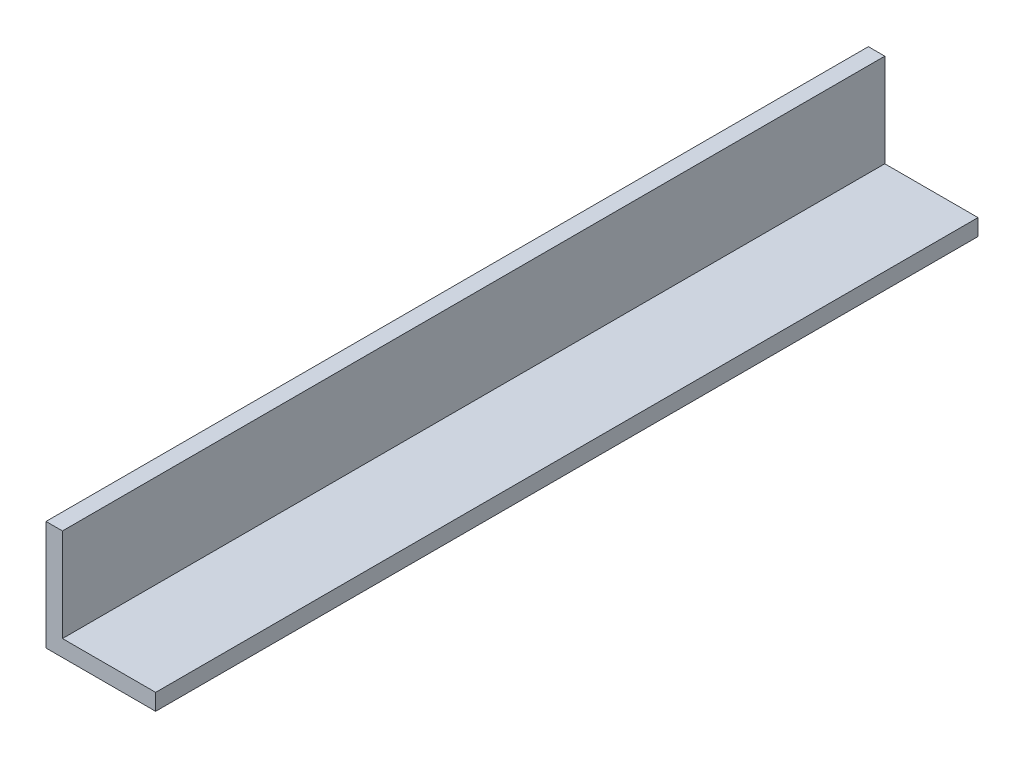
ISO-10303-21;
HEADER;
FILE_DESCRIPTION(('STEP AP214'),'2;1');
FILE_NAME('part.step','',(''),(''),'','','');
FILE_SCHEMA(('AUTOMOTIVE_DESIGN { 1 0 10303 214 1 1 1 1 }'));
ENDSEC;
DATA;
#1=APPLICATION_CONTEXT('core data for automotive mechanical design processes');
#2=APPLICATION_PROTOCOL_DEFINITION('international standard','automotive_design',2000,#1);
#3=PRODUCT_CONTEXT('',#1,'mechanical');
#4=PRODUCT('Part','Part','',(#3));
#5=PRODUCT_RELATED_PRODUCT_CATEGORY('part','',(#4));
#6=PRODUCT_DEFINITION_FORMATION('','',#4);
#7=PRODUCT_DEFINITION_CONTEXT('part definition',#1,'design');
#8=PRODUCT_DEFINITION('design','',#6,#7);
#9=PRODUCT_DEFINITION_SHAPE('','',#8);
#10=(LENGTH_UNIT() NAMED_UNIT(*) SI_UNIT(.MILLI.,.METRE.));
#11=(NAMED_UNIT(*) PLANE_ANGLE_UNIT() SI_UNIT($,.RADIAN.));
#12=(NAMED_UNIT(*) SI_UNIT($,.STERADIAN.) SOLID_ANGLE_UNIT());
#13=UNCERTAINTY_MEASURE_WITH_UNIT(LENGTH_MEASURE(1.E-05),#10,'distance_accuracy_value','');
#14=(GEOMETRIC_REPRESENTATION_CONTEXT(3) GLOBAL_UNCERTAINTY_ASSIGNED_CONTEXT((#13)) GLOBAL_UNIT_ASSIGNED_CONTEXT((#10,
#11,#12)) REPRESENTATION_CONTEXT('',''));
#15=CARTESIAN_POINT('',(0.,0.,0.));
#16=DIRECTION('',(0.,0.,1.));
#17=DIRECTION('',(1.,0.,0.));
#18=AXIS2_PLACEMENT_3D('',#15,#16,#17);
#19=CARTESIAN_POINT('',(20.,0.,150.));
#20=DIRECTION('',(-1.,0.,0.));
#21=DIRECTION('',(0.,0.,1.));
#22=AXIS2_PLACEMENT_3D('',#19,#20,#21);
#23=PLANE('',#22);
#24=DIRECTION('',(0.,1.,0.));
#25=VECTOR('',#24,1.);
#26=CARTESIAN_POINT('',(20.,0.,0.));
#27=LINE('',#26,#25);
#28=CARTESIAN_POINT('',(20.,0.,0.));
#29=VERTEX_POINT('',#28);
#30=CARTESIAN_POINT('',(20.,3.,0.));
#31=VERTEX_POINT('',#30);
#32=EDGE_CURVE('E128',#29,#31,#27,.T.);
#33=ORIENTED_EDGE('',*,*,#32,.T.);
#34=DIRECTION('',(0.,0.,-1.));
#35=VECTOR('',#34,1.);
#36=CARTESIAN_POINT('',(20.,3.,150.));
#37=LINE('',#36,#35);
#38=CARTESIAN_POINT('',(20.,3.,150.));
#39=VERTEX_POINT('',#38);
#40=EDGE_CURVE('E11',#39,#31,#37,.T.);
#41=ORIENTED_EDGE('',*,*,#40,.F.);
#42=DIRECTION('',(0.,1.,0.));
#43=VECTOR('',#42,1.);
#44=CARTESIAN_POINT('',(20.,0.,150.));
#45=LINE('',#44,#43);
#46=CARTESIAN_POINT('',(20.,0.,150.));
#47=VERTEX_POINT('',#46);
#48=EDGE_CURVE('E144',#47,#39,#45,.T.);
#49=ORIENTED_EDGE('',*,*,#48,.F.);
#50=DIRECTION('',(0.,0.,-1.));
#51=VECTOR('',#50,1.);
#52=CARTESIAN_POINT('',(20.,0.,150.));
#53=LINE('',#52,#51);
#54=EDGE_CURVE('E124',#47,#29,#53,.T.);
#55=ORIENTED_EDGE('',*,*,#54,.T.);
#56=EDGE_LOOP('',(#33,#41,#49,#55));
#57=FACE_BOUND('',#56,.T.);
#58=ADVANCED_FACE('F39',(#57),#23,.F.);
#59=CARTESIAN_POINT('',(20.,3.,150.));
#60=DIRECTION('',(0.,-1.,0.));
#61=DIRECTION('',(0.,0.,-1.));
#62=AXIS2_PLACEMENT_3D('',#59,#60,#61);
#63=PLANE('',#62);
#64=DIRECTION('',(-1.,0.,0.));
#65=VECTOR('',#64,1.);
#66=CARTESIAN_POINT('',(20.,3.,0.));
#67=LINE('',#66,#65);
#68=CARTESIAN_POINT('',(3.,3.,0.));
#69=VERTEX_POINT('',#68);
#70=EDGE_CURVE('E132',#31,#69,#67,.T.);
#71=ORIENTED_EDGE('',*,*,#70,.T.);
#72=DIRECTION('',(0.,0.,-1.));
#73=VECTOR('',#72,1.);
#74=CARTESIAN_POINT('',(3.,3.,150.));
#75=LINE('',#74,#73);
#76=CARTESIAN_POINT('',(3.,3.,150.));
#77=VERTEX_POINT('',#76);
#78=EDGE_CURVE('E48',#77,#69,#75,.T.);
#79=ORIENTED_EDGE('',*,*,#78,.F.);
#80=DIRECTION('',(-1.,0.,0.));
#81=VECTOR('',#80,1.);
#82=CARTESIAN_POINT('',(20.,3.,150.));
#83=LINE('',#82,#81);
#84=EDGE_CURVE('E93',#39,#77,#83,.T.);
#85=ORIENTED_EDGE('',*,*,#84,.F.);
#86=ORIENTED_EDGE('',*,*,#40,.T.);
#87=EDGE_LOOP('',(#71,#79,#85,#86));
#88=FACE_BOUND('',#87,.T.);
#89=ADVANCED_FACE('F172',(#88),#63,.F.);
#90=CARTESIAN_POINT('',(3.,20.,150.));
#91=DIRECTION('',(-1.,0.,0.));
#92=DIRECTION('',(0.,-1.,0.));
#93=AXIS2_PLACEMENT_3D('',#90,#91,#92);
#94=PLANE('',#93);
#95=DIRECTION('',(0.,1.,0.));
#96=VECTOR('',#95,1.);
#97=CARTESIAN_POINT('',(3.,20.,0.));
#98=LINE('',#97,#96);
#99=CARTESIAN_POINT('',(3.,20.,0.));
#100=VERTEX_POINT('',#99);
#101=EDGE_CURVE('E135',#69,#100,#98,.T.);
#102=ORIENTED_EDGE('',*,*,#101,.T.);
#103=DIRECTION('',(0.,0.,-1.));
#104=VECTOR('',#103,1.);
#105=CARTESIAN_POINT('',(3.,20.,150.));
#106=LINE('',#105,#104);
#107=CARTESIAN_POINT('',(3.,20.,150.));
#108=VERTEX_POINT('',#107);
#109=EDGE_CURVE('E117',#108,#100,#106,.T.);
#110=ORIENTED_EDGE('',*,*,#109,.F.);
#111=DIRECTION('',(0.,1.,0.));
#112=VECTOR('',#111,1.);
#113=CARTESIAN_POINT('',(3.,20.,150.));
#114=LINE('',#113,#112);
#115=EDGE_CURVE('E106',#77,#108,#114,.T.);
#116=ORIENTED_EDGE('',*,*,#115,.F.);
#117=ORIENTED_EDGE('',*,*,#78,.T.);
#118=EDGE_LOOP('',(#102,#110,#116,#117));
#119=FACE_BOUND('',#118,.T.);
#120=ADVANCED_FACE('F154',(#119),#94,.F.);
#121=CARTESIAN_POINT('',(0.,20.,150.));
#122=DIRECTION('',(0.,-1.,0.));
#123=DIRECTION('',(0.,0.,-1.));
#124=AXIS2_PLACEMENT_3D('',#121,#122,#123);
#125=PLANE('',#124);
#126=DIRECTION('',(-1.,0.,0.));
#127=VECTOR('',#126,1.);
#128=CARTESIAN_POINT('',(0.,20.,0.));
#129=LINE('',#128,#127);
#130=CARTESIAN_POINT('',(0.,20.,0.));
#131=VERTEX_POINT('',#130);
#132=EDGE_CURVE('E115',#100,#131,#129,.T.);
#133=ORIENTED_EDGE('',*,*,#132,.T.);
#134=DIRECTION('',(0.,0.,-1.));
#135=VECTOR('',#134,1.);
#136=CARTESIAN_POINT('',(0.,20.,150.));
#137=LINE('',#136,#135);
#138=CARTESIAN_POINT('',(0.,20.,150.));
#139=VERTEX_POINT('',#138);
#140=EDGE_CURVE('E112',#139,#131,#137,.T.);
#141=ORIENTED_EDGE('',*,*,#140,.F.);
#142=DIRECTION('',(-1.,0.,0.));
#143=VECTOR('',#142,1.);
#144=CARTESIAN_POINT('',(0.,20.,150.));
#145=LINE('',#144,#143);
#146=EDGE_CURVE('E100',#108,#139,#145,.T.);
#147=ORIENTED_EDGE('',*,*,#146,.F.);
#148=ORIENTED_EDGE('',*,*,#109,.T.);
#149=EDGE_LOOP('',(#133,#141,#147,#148));
#150=FACE_BOUND('',#149,.T.);
#151=ADVANCED_FACE('F113',(#150),#125,.F.);
#152=CARTESIAN_POINT('',(0.,0.,150.));
#153=DIRECTION('',(1.,0.,0.));
#154=DIRECTION('',(0.,0.,-1.));
#155=AXIS2_PLACEMENT_3D('',#152,#153,#154);
#156=PLANE('',#155);
#157=DIRECTION('',(0.,-1.,0.));
#158=VECTOR('',#157,1.);
#159=CARTESIAN_POINT('',(0.,0.,0.));
#160=LINE('',#159,#158);
#161=CARTESIAN_POINT('',(0.,0.,0.));
#162=VERTEX_POINT('',#161);
#163=EDGE_CURVE('E79',#131,#162,#160,.T.);
#164=ORIENTED_EDGE('',*,*,#163,.T.);
#165=DIRECTION('',(0.,0.,-1.));
#166=VECTOR('',#165,1.);
#167=CARTESIAN_POINT('',(0.,0.,150.));
#168=LINE('',#167,#166);
#169=CARTESIAN_POINT('',(0.,0.,150.));
#170=VERTEX_POINT('',#169);
#171=EDGE_CURVE('E118',#170,#162,#168,.T.);
#172=ORIENTED_EDGE('',*,*,#171,.F.);
#173=DIRECTION('',(0.,-1.,0.));
#174=VECTOR('',#173,1.);
#175=CARTESIAN_POINT('',(0.,0.,150.));
#176=LINE('',#175,#174);
#177=EDGE_CURVE('E104',#139,#170,#176,.T.);
#178=ORIENTED_EDGE('',*,*,#177,.F.);
#179=ORIENTED_EDGE('',*,*,#140,.T.);
#180=EDGE_LOOP('',(#164,#172,#178,#179));
#181=FACE_BOUND('',#180,.T.);
#182=ADVANCED_FACE('F120',(#181),#156,.F.);
#183=CARTESIAN_POINT('',(0.,0.,150.));
#184=DIRECTION('',(0.,1.,0.));
#185=DIRECTION('',(0.,0.,1.));
#186=AXIS2_PLACEMENT_3D('',#183,#184,#185);
#187=PLANE('',#186);
#188=DIRECTION('',(1.,0.,0.));
#189=VECTOR('',#188,1.);
#190=CARTESIAN_POINT('',(0.,0.,0.));
#191=LINE('',#190,#189);
#192=EDGE_CURVE('E85',#162,#29,#191,.T.);
#193=ORIENTED_EDGE('',*,*,#192,.T.);
#194=ORIENTED_EDGE('',*,*,#54,.F.);
#195=DIRECTION('',(1.,0.,0.));
#196=VECTOR('',#195,1.);
#197=CARTESIAN_POINT('',(0.,0.,150.));
#198=LINE('',#197,#196);
#199=EDGE_CURVE('E56',#170,#47,#198,.T.);
#200=ORIENTED_EDGE('',*,*,#199,.F.);
#201=ORIENTED_EDGE('',*,*,#171,.T.);
#202=EDGE_LOOP('',(#193,#194,#200,#201));
#203=FACE_BOUND('',#202,.T.);
#204=ADVANCED_FACE('F161',(#203),#187,.F.);
#205=CARTESIAN_POINT('',(0.,0.,150.));
#206=DIRECTION('',(0.,0.,1.));
#207=DIRECTION('',(1.,0.,0.));
#208=AXIS2_PLACEMENT_3D('',#205,#206,#207);
#209=PLANE('',#208);
#210=ORIENTED_EDGE('',*,*,#48,.T.);
#211=ORIENTED_EDGE('',*,*,#84,.T.);
#212=ORIENTED_EDGE('',*,*,#115,.T.);
#213=ORIENTED_EDGE('',*,*,#146,.T.);
#214=ORIENTED_EDGE('',*,*,#177,.T.);
#215=ORIENTED_EDGE('',*,*,#199,.T.);
#216=EDGE_LOOP('',(#210,#211,#212,#213,#214,#215));
#217=FACE_BOUND('',#216,.T.);
#218=ADVANCED_FACE('F102',(#217),#209,.T.);
#219=CARTESIAN_POINT('',(0.,0.,0.));
#220=DIRECTION('',(0.,0.,1.));
#221=DIRECTION('',(1.,0.,0.));
#222=AXIS2_PLACEMENT_3D('',#219,#220,#221);
#223=PLANE('',#222);
#224=ORIENTED_EDGE('',*,*,#32,.F.);
#225=ORIENTED_EDGE('',*,*,#192,.F.);
#226=ORIENTED_EDGE('',*,*,#163,.F.);
#227=ORIENTED_EDGE('',*,*,#132,.F.);
#228=ORIENTED_EDGE('',*,*,#101,.F.);
#229=ORIENTED_EDGE('',*,*,#70,.F.);
#230=EDGE_LOOP('',(#224,#225,#226,#227,#228,#229));
#231=FACE_BOUND('',#230,.T.);
#232=ADVANCED_FACE('F157',(#231),#223,.F.);
#233=CLOSED_SHELL('',(#58,#89,#120,#151,#182,#204,#218,#232));
#234=MANIFOLD_SOLID_BREP('B2',#233);
#235=ADVANCED_BREP_SHAPE_REPRESENTATION('',(#18,#234),#14);
#236=SHAPE_DEFINITION_REPRESENTATION(#9,#235);
ENDSEC;
END-ISO-10303-21;
